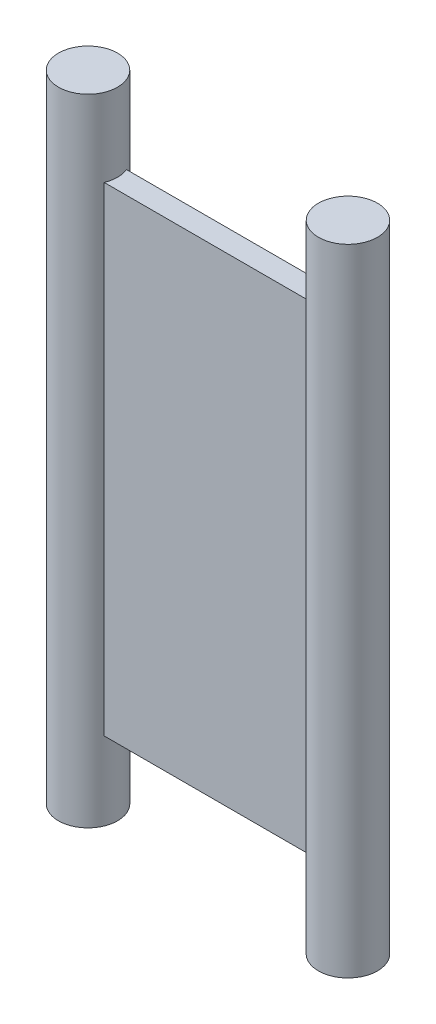
ISO-10303-21;
HEADER;
FILE_DESCRIPTION(('STEP AP214'),'2;1');
FILE_NAME('part.step','',(''),(''),'','','');
FILE_SCHEMA(('AUTOMOTIVE_DESIGN { 1 0 10303 214 1 1 1 1 }'));
ENDSEC;
DATA;
#1=APPLICATION_CONTEXT('core data for automotive mechanical design processes');
#2=APPLICATION_PROTOCOL_DEFINITION('international standard','automotive_design',2000,#1);
#3=PRODUCT_CONTEXT('',#1,'mechanical');
#4=PRODUCT('Part','Part','',(#3));
#5=PRODUCT_RELATED_PRODUCT_CATEGORY('part','',(#4));
#6=PRODUCT_DEFINITION_FORMATION('','',#4);
#7=PRODUCT_DEFINITION_CONTEXT('part definition',#1,'design');
#8=PRODUCT_DEFINITION('design','',#6,#7);
#9=PRODUCT_DEFINITION_SHAPE('','',#8);
#10=(LENGTH_UNIT() NAMED_UNIT(*) SI_UNIT(.MILLI.,.METRE.));
#11=(NAMED_UNIT(*) PLANE_ANGLE_UNIT() SI_UNIT($,.RADIAN.));
#12=(NAMED_UNIT(*) SI_UNIT($,.STERADIAN.) SOLID_ANGLE_UNIT());
#13=UNCERTAINTY_MEASURE_WITH_UNIT(LENGTH_MEASURE(1.E-05),#10,'distance_accuracy_value','');
#14=(GEOMETRIC_REPRESENTATION_CONTEXT(3) GLOBAL_UNCERTAINTY_ASSIGNED_CONTEXT((#13)) GLOBAL_UNIT_ASSIGNED_CONTEXT((#10,
#11,#12)) REPRESENTATION_CONTEXT('',''));
#15=CARTESIAN_POINT('',(0.,0.,0.));
#16=DIRECTION('',(0.,0.,1.));
#17=DIRECTION('',(1.,0.,0.));
#18=AXIS2_PLACEMENT_3D('',#15,#16,#17);
#19=CARTESIAN_POINT('',(5.83,21.5,0.499999999999999));
#20=DIRECTION('',(0.,0.,-1.));
#21=DIRECTION('',(-1.,0.,0.));
#22=AXIS2_PLACEMENT_3D('',#19,#20,#21);
#23=PLANE('',#22);
#24=DIRECTION('',(0.,-1.,0.));
#25=VECTOR('',#24,1.);
#26=CARTESIAN_POINT('',(4.6029608808192,25.,0.499999999999999));
#27=LINE('',#26,#25);
#28=CARTESIAN_POINT('',(4.6029608808192,21.5,0.499999999999999));
#29=VERTEX_POINT('',#28);
#30=CARTESIAN_POINT('',(4.6029608808192,0.,0.499999999999999));
#31=VERTEX_POINT('',#30);
#32=EDGE_CURVE('E53',#29,#31,#27,.T.);
#33=ORIENTED_EDGE('',*,*,#32,.F.);
#34=DIRECTION('',(1.,0.,0.));
#35=VECTOR('',#34,1.);
#36=CARTESIAN_POINT('',(5.83,21.5,0.499999999999999));
#37=LINE('',#36,#35);
#38=CARTESIAN_POINT('',(-4.6029608808192,21.5,0.500000000000001));
#39=VERTEX_POINT('',#38);
#40=EDGE_CURVE('E90',#39,#29,#37,.T.);
#41=ORIENTED_EDGE('',*,*,#40,.F.);
#42=DIRECTION('',(0.,-1.,0.));
#43=VECTOR('',#42,1.);
#44=CARTESIAN_POINT('',(-4.6029608808192,25.,0.500000000000001));
#45=LINE('',#44,#43);
#46=CARTESIAN_POINT('',(-4.6029608808192,0.,0.500000000000001));
#47=VERTEX_POINT('',#46);
#48=EDGE_CURVE('E103',#47,#39,#45,.F.);
#49=ORIENTED_EDGE('',*,*,#48,.F.);
#50=DIRECTION('',(1.,0.,0.));
#51=VECTOR('',#50,1.);
#52=CARTESIAN_POINT('',(5.83,0.,0.499999999999999));
#53=LINE('',#52,#51);
#54=EDGE_CURVE('E91',#47,#31,#53,.T.);
#55=ORIENTED_EDGE('',*,*,#54,.T.);
#56=EDGE_LOOP('',(#33,#41,#49,#55));
#57=FACE_BOUND('',#56,.T.);
#58=ADVANCED_FACE('F39',(#57),#23,.F.);
#59=CARTESIAN_POINT('',(5.83,21.5,-0.500000000000001));
#60=DIRECTION('',(0.,0.,1.));
#61=DIRECTION('',(1.,0.,0.));
#62=AXIS2_PLACEMENT_3D('',#59,#60,#61);
#63=PLANE('',#62);
#64=DIRECTION('',(0.,-1.,0.));
#65=VECTOR('',#64,1.);
#66=CARTESIAN_POINT('',(4.6029608808192,25.,-0.500000000000001));
#67=LINE('',#66,#65);
#68=CARTESIAN_POINT('',(4.6029608808192,0.,-0.500000000000001));
#69=VERTEX_POINT('',#68);
#70=CARTESIAN_POINT('',(4.6029608808192,21.5,-0.500000000000001));
#71=VERTEX_POINT('',#70);
#72=EDGE_CURVE('E78',#69,#71,#67,.F.);
#73=ORIENTED_EDGE('',*,*,#72,.F.);
#74=DIRECTION('',(-1.,0.,0.));
#75=VECTOR('',#74,1.);
#76=CARTESIAN_POINT('',(5.83,0.,-0.500000000000001));
#77=LINE('',#76,#75);
#78=CARTESIAN_POINT('',(-4.6029608808192,0.,-0.499999999999999));
#79=VERTEX_POINT('',#78);
#80=EDGE_CURVE('E60',#69,#79,#77,.T.);
#81=ORIENTED_EDGE('',*,*,#80,.T.);
#82=DIRECTION('',(0.,-1.,0.));
#83=VECTOR('',#82,1.);
#84=CARTESIAN_POINT('',(-4.6029608808192,25.,-0.499999999999999));
#85=LINE('',#84,#83);
#86=CARTESIAN_POINT('',(-4.6029608808192,21.5,-0.499999999999999));
#87=VERTEX_POINT('',#86);
#88=EDGE_CURVE('E105',#87,#79,#85,.T.);
#89=ORIENTED_EDGE('',*,*,#88,.F.);
#90=DIRECTION('',(-1.,0.,0.));
#91=VECTOR('',#90,1.);
#92=CARTESIAN_POINT('',(5.83,21.5,-0.500000000000001));
#93=LINE('',#92,#91);
#94=EDGE_CURVE('E85',#71,#87,#93,.T.);
#95=ORIENTED_EDGE('',*,*,#94,.F.);
#96=EDGE_LOOP('',(#73,#81,#89,#95));
#97=FACE_BOUND('',#96,.T.);
#98=ADVANCED_FACE('F84',(#97),#63,.F.);
#99=CARTESIAN_POINT('',(-5.83,25.,0.));
#100=DIRECTION('',(0.,-1.,0.));
#101=DIRECTION('',(0.,0.,-1.));
#102=AXIS2_PLACEMENT_3D('',#99,#100,#101);
#103=CYLINDRICAL_SURFACE('',#102,1.325);
#104=CARTESIAN_POINT('',(-5.83,25.,0.));
#105=DIRECTION('',(0.,1.,0.));
#106=DIRECTION('',(0.,0.,1.));
#107=AXIS2_PLACEMENT_3D('',#104,#105,#106);
#108=CIRCLE('',#107,1.325);
#109=CARTESIAN_POINT('',(-5.83,25.,1.325));
#110=VERTEX_POINT('',#109);
#111=EDGE_CURVE('E107',#110,#110,#108,.T.);
#112=ORIENTED_EDGE('',*,*,#111,.F.);
#113=EDGE_LOOP('',(#112));
#114=FACE_BOUND('',#113,.T.);
#115=CARTESIAN_POINT('',(-5.83,-3.5,0.));
#116=DIRECTION('',(0.,1.,0.));
#117=DIRECTION('',(0.,0.,1.));
#118=AXIS2_PLACEMENT_3D('',#115,#116,#117);
#119=CIRCLE('',#118,1.325);
#120=CARTESIAN_POINT('',(-5.83,-3.5,1.325));
#121=VERTEX_POINT('',#120);
#122=EDGE_CURVE('E108',#121,#121,#119,.T.);
#123=ORIENTED_EDGE('',*,*,#122,.T.);
#124=EDGE_LOOP('',(#123));
#125=FACE_BOUND('',#124,.T.);
#126=ORIENTED_EDGE('',*,*,#48,.T.);
#127=CARTESIAN_POINT('',(-5.83,21.5,0.));
#128=DIRECTION('',(0.,-1.,0.));
#129=DIRECTION('',(0.,0.,-1.));
#130=AXIS2_PLACEMENT_3D('',#127,#128,#129);
#131=CIRCLE('',#130,1.325);
#132=EDGE_CURVE('E95',#39,#87,#131,.F.);
#133=ORIENTED_EDGE('',*,*,#132,.T.);
#134=ORIENTED_EDGE('',*,*,#88,.T.);
#135=CARTESIAN_POINT('',(-5.83,0.,0.));
#136=DIRECTION('',(0.,-1.,0.));
#137=DIRECTION('',(0.,0.,-1.));
#138=AXIS2_PLACEMENT_3D('',#135,#136,#137);
#139=CIRCLE('',#138,1.325);
#140=EDGE_CURVE('E46',#47,#79,#139,.F.);
#141=ORIENTED_EDGE('',*,*,#140,.F.);
#142=EDGE_LOOP('',(#126,#133,#134,#141));
#143=FACE_BOUND('',#142,.T.);
#144=ADVANCED_FACE('F138',(#114,#125,#143),#103,.T.);
#145=CARTESIAN_POINT('',(-5.83,25.,0.));
#146=DIRECTION('',(0.,1.,0.));
#147=DIRECTION('',(0.,0.,1.));
#148=AXIS2_PLACEMENT_3D('',#145,#146,#147);
#149=PLANE('',#148);
#150=ORIENTED_EDGE('',*,*,#111,.T.);
#151=EDGE_LOOP('',(#150));
#152=FACE_BOUND('',#151,.T.);
#153=ADVANCED_FACE('F144',(#152),#149,.T.);
#154=CARTESIAN_POINT('',(-5.83,-3.5,0.));
#155=DIRECTION('',(0.,1.,0.));
#156=DIRECTION('',(0.,0.,1.));
#157=AXIS2_PLACEMENT_3D('',#154,#155,#156);
#158=PLANE('',#157);
#159=ORIENTED_EDGE('',*,*,#122,.F.);
#160=EDGE_LOOP('',(#159));
#161=FACE_BOUND('',#160,.T.);
#162=ADVANCED_FACE('F150',(#161),#158,.F.);
#163=CARTESIAN_POINT('',(0.,21.5,0.));
#164=DIRECTION('',(0.,-1.,0.));
#165=DIRECTION('',(0.,0.,-1.));
#166=AXIS2_PLACEMENT_3D('',#163,#164,#165);
#167=PLANE('',#166);
#168=CARTESIAN_POINT('',(5.83,21.5,0.));
#169=DIRECTION('',(0.,-1.,0.));
#170=DIRECTION('',(0.,0.,-1.));
#171=AXIS2_PLACEMENT_3D('',#168,#169,#170);
#172=CIRCLE('',#171,1.325);
#173=EDGE_CURVE('E111',#71,#29,#172,.F.);
#174=ORIENTED_EDGE('',*,*,#173,.F.);
#175=ORIENTED_EDGE('',*,*,#94,.T.);
#176=ORIENTED_EDGE('',*,*,#132,.F.);
#177=ORIENTED_EDGE('',*,*,#40,.T.);
#178=EDGE_LOOP('',(#174,#175,#176,#177));
#179=FACE_BOUND('',#178,.T.);
#180=ADVANCED_FACE('F141',(#179),#167,.F.);
#181=CARTESIAN_POINT('',(0.,0.,0.));
#182=DIRECTION('',(0.,-1.,0.));
#183=DIRECTION('',(0.,0.,-1.));
#184=AXIS2_PLACEMENT_3D('',#181,#182,#183);
#185=PLANE('',#184);
#186=ORIENTED_EDGE('',*,*,#80,.F.);
#187=CARTESIAN_POINT('',(5.83,0.,0.));
#188=DIRECTION('',(0.,-1.,0.));
#189=DIRECTION('',(0.,0.,-1.));
#190=AXIS2_PLACEMENT_3D('',#187,#188,#189);
#191=CIRCLE('',#190,1.325);
#192=EDGE_CURVE('E11',#69,#31,#191,.F.);
#193=ORIENTED_EDGE('',*,*,#192,.T.);
#194=ORIENTED_EDGE('',*,*,#54,.F.);
#195=ORIENTED_EDGE('',*,*,#140,.T.);
#196=EDGE_LOOP('',(#186,#193,#194,#195));
#197=FACE_BOUND('',#196,.T.);
#198=ADVANCED_FACE('F89',(#197),#185,.T.);
#199=CARTESIAN_POINT('',(5.83,25.,0.));
#200=DIRECTION('',(0.,-1.,0.));
#201=DIRECTION('',(0.,0.,-1.));
#202=AXIS2_PLACEMENT_3D('',#199,#200,#201);
#203=CYLINDRICAL_SURFACE('',#202,1.325);
#204=CARTESIAN_POINT('',(5.83,25.,0.));
#205=DIRECTION('',(0.,1.,0.));
#206=DIRECTION('',(0.,0.,1.));
#207=AXIS2_PLACEMENT_3D('',#204,#205,#206);
#208=CIRCLE('',#207,1.325);
#209=CARTESIAN_POINT('',(5.83,25.,1.325));
#210=VERTEX_POINT('',#209);
#211=EDGE_CURVE('E116',#210,#210,#208,.T.);
#212=ORIENTED_EDGE('',*,*,#211,.F.);
#213=EDGE_LOOP('',(#212));
#214=FACE_BOUND('',#213,.T.);
#215=CARTESIAN_POINT('',(5.83,-3.5,0.));
#216=DIRECTION('',(0.,1.,0.));
#217=DIRECTION('',(0.,0.,1.));
#218=AXIS2_PLACEMENT_3D('',#215,#216,#217);
#219=CIRCLE('',#218,1.325);
#220=CARTESIAN_POINT('',(5.83,-3.5,1.325));
#221=VERTEX_POINT('',#220);
#222=EDGE_CURVE('E86',#221,#221,#219,.T.);
#223=ORIENTED_EDGE('',*,*,#222,.T.);
#224=EDGE_LOOP('',(#223));
#225=FACE_BOUND('',#224,.T.);
#226=ORIENTED_EDGE('',*,*,#72,.T.);
#227=ORIENTED_EDGE('',*,*,#173,.T.);
#228=ORIENTED_EDGE('',*,*,#32,.T.);
#229=ORIENTED_EDGE('',*,*,#192,.F.);
#230=EDGE_LOOP('',(#226,#227,#228,#229));
#231=FACE_BOUND('',#230,.T.);
#232=ADVANCED_FACE('F77',(#214,#225,#231),#203,.T.);
#233=CARTESIAN_POINT('',(5.83,25.,0.));
#234=DIRECTION('',(0.,1.,0.));
#235=DIRECTION('',(0.,0.,1.));
#236=AXIS2_PLACEMENT_3D('',#233,#234,#235);
#237=PLANE('',#236);
#238=ORIENTED_EDGE('',*,*,#211,.T.);
#239=EDGE_LOOP('',(#238));
#240=FACE_BOUND('',#239,.T.);
#241=ADVANCED_FACE('F125',(#240),#237,.T.);
#242=CARTESIAN_POINT('',(5.83,-3.5,0.));
#243=DIRECTION('',(0.,1.,0.));
#244=DIRECTION('',(0.,0.,1.));
#245=AXIS2_PLACEMENT_3D('',#242,#243,#244);
#246=PLANE('',#245);
#247=ORIENTED_EDGE('',*,*,#222,.F.);
#248=EDGE_LOOP('',(#247));
#249=FACE_BOUND('',#248,.T.);
#250=ADVANCED_FACE('F123',(#249),#246,.F.);
#251=CLOSED_SHELL('',(#58,#98,#144,#153,#162,#180,#198,#232,#241,#250));
#252=MANIFOLD_SOLID_BREP('B2',#251);
#253=ADVANCED_BREP_SHAPE_REPRESENTATION('',(#18,#252),#14);
#254=SHAPE_DEFINITION_REPRESENTATION(#9,#253);
ENDSEC;
END-ISO-10303-21;
